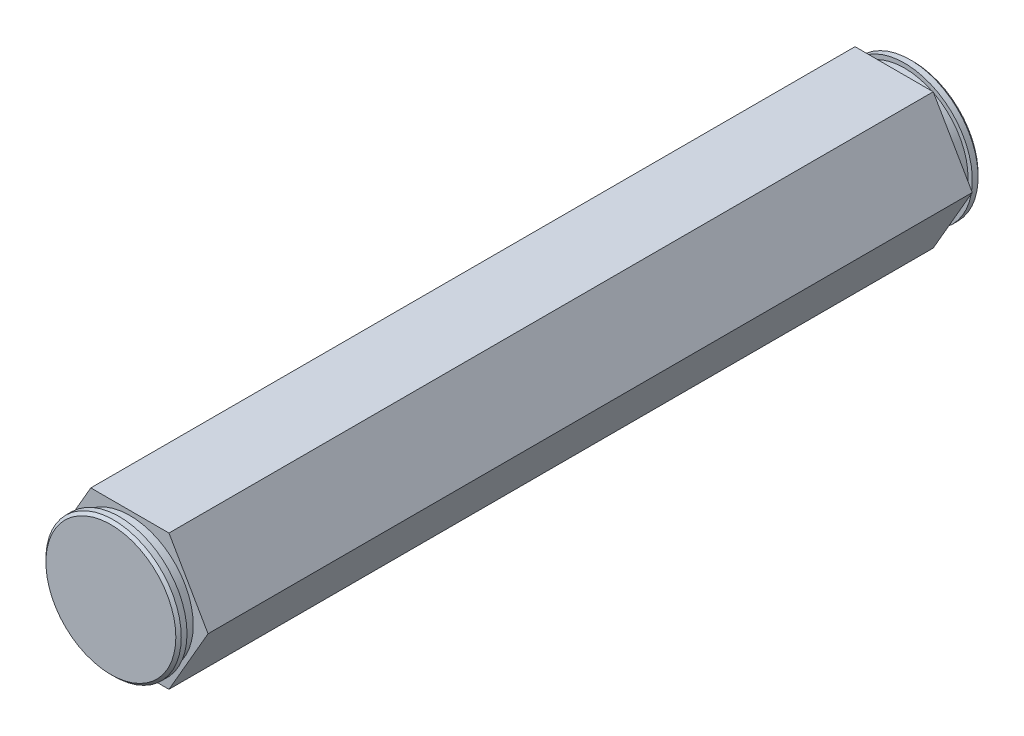
ISO-10303-21;
HEADER;
FILE_DESCRIPTION(('STEP AP214'),'2;1');
FILE_NAME('part.step','',(''),(''),'','','');
FILE_SCHEMA(('AUTOMOTIVE_DESIGN { 1 0 10303 214 1 1 1 1 }'));
ENDSEC;
DATA;
#1=APPLICATION_CONTEXT('core data for automotive mechanical design processes');
#2=APPLICATION_PROTOCOL_DEFINITION('international standard','automotive_design',2000,#1);
#3=PRODUCT_CONTEXT('',#1,'mechanical');
#4=PRODUCT('Part','Part','',(#3));
#5=PRODUCT_RELATED_PRODUCT_CATEGORY('part','',(#4));
#6=PRODUCT_DEFINITION_FORMATION('','',#4);
#7=PRODUCT_DEFINITION_CONTEXT('part definition',#1,'design');
#8=PRODUCT_DEFINITION('design','',#6,#7);
#9=PRODUCT_DEFINITION_SHAPE('','',#8);
#10=(LENGTH_UNIT() NAMED_UNIT(*) SI_UNIT(.MILLI.,.METRE.));
#11=(NAMED_UNIT(*) PLANE_ANGLE_UNIT() SI_UNIT($,.RADIAN.));
#12=(NAMED_UNIT(*) SI_UNIT($,.STERADIAN.) SOLID_ANGLE_UNIT());
#13=UNCERTAINTY_MEASURE_WITH_UNIT(LENGTH_MEASURE(1.E-05),#10,'distance_accuracy_value','');
#14=(GEOMETRIC_REPRESENTATION_CONTEXT(3) GLOBAL_UNCERTAINTY_ASSIGNED_CONTEXT((#13)) GLOBAL_UNIT_ASSIGNED_CONTEXT((#10,
#11,#12)) REPRESENTATION_CONTEXT('',''));
#15=CARTESIAN_POINT('',(0.,0.,0.));
#16=DIRECTION('',(0.,0.,1.));
#17=DIRECTION('',(1.,0.,0.));
#18=AXIS2_PLACEMENT_3D('',#15,#16,#17);
#19=CARTESIAN_POINT('',(0.,0.,57.404));
#20=DIRECTION('',(0.,0.,1.));
#21=DIRECTION('',(1.,0.,0.));
#22=AXIS2_PLACEMENT_3D('',#19,#20,#21);
#23=PLANE('',#22);
#24=DIRECTION('',(-0.500000000000007,0.866025403784435,0.));
#25=VECTOR('',#24,1.);
#26=CARTESIAN_POINT('',(7.33234841870824,1.02782365951626E-13,57.404));
#27=LINE('',#26,#25);
#28=CARTESIAN_POINT('',(7.33234841870824,1.02782365951626E-13,57.404));
#29=VERTEX_POINT('',#28);
#30=CARTESIAN_POINT('',(3.6661742093541,6.35,57.404));
#31=VERTEX_POINT('',#30);
#32=EDGE_CURVE('E92',#29,#31,#27,.T.);
#33=ORIENTED_EDGE('',*,*,#32,.T.);
#34=DIRECTION('',(-1.,0.,0.));
#35=VECTOR('',#34,1.);
#36=CARTESIAN_POINT('',(3.6661742093541,6.35,57.404));
#37=LINE('',#36,#35);
#38=CARTESIAN_POINT('',(-3.66617420935415,6.34999999999998,57.404));
#39=VERTEX_POINT('',#38);
#40=EDGE_CURVE('E100',#31,#39,#37,.T.);
#41=ORIENTED_EDGE('',*,*,#40,.T.);
#42=DIRECTION('',(-0.499999999999995,-0.866025403784442,0.));
#43=VECTOR('',#42,1.);
#44=CARTESIAN_POINT('',(-3.66617420935415,6.34999999999998,57.404));
#45=LINE('',#44,#43);
#46=CARTESIAN_POINT('',(-7.33234841870824,0.,57.404));
#47=VERTEX_POINT('',#46);
#48=EDGE_CURVE('E106',#39,#47,#45,.T.);
#49=ORIENTED_EDGE('',*,*,#48,.T.);
#50=DIRECTION('',(0.500000000000007,-0.866025403784435,0.));
#51=VECTOR('',#50,1.);
#52=CARTESIAN_POINT('',(-7.33234841870824,0.,57.404));
#53=LINE('',#52,#51);
#54=CARTESIAN_POINT('',(-3.66617420935406,-6.35000000000003,57.404));
#55=VERTEX_POINT('',#54);
#56=EDGE_CURVE('E121',#47,#55,#53,.T.);
#57=ORIENTED_EDGE('',*,*,#56,.T.);
#58=DIRECTION('',(1.,0.,0.));
#59=VECTOR('',#58,1.);
#60=CARTESIAN_POINT('',(-3.66617420935406,-6.35000000000003,57.404));
#61=LINE('',#60,#59);
#62=CARTESIAN_POINT('',(3.66617420935419,-6.34999999999995,57.404));
#63=VERTEX_POINT('',#62);
#64=EDGE_CURVE('E124',#55,#63,#61,.T.);
#65=ORIENTED_EDGE('',*,*,#64,.T.);
#66=DIRECTION('',(0.499999999999989,0.866025403784445,0.));
#67=VECTOR('',#66,1.);
#68=CARTESIAN_POINT('',(3.66617420935419,-6.34999999999995,57.404));
#69=LINE('',#68,#67);
#70=EDGE_CURVE('E112',#63,#29,#69,.T.);
#71=ORIENTED_EDGE('',*,*,#70,.T.);
#72=EDGE_LOOP('',(#33,#41,#49,#57,#65,#71));
#73=FACE_BOUND('',#72,.T.);
#74=CARTESIAN_POINT('',(0.,0.,57.404));
#75=DIRECTION('',(0.,0.,1.));
#76=DIRECTION('',(1.,0.,0.));
#77=AXIS2_PLACEMENT_3D('',#74,#75,#76);
#78=CIRCLE('',#77,5.9436);
#79=CARTESIAN_POINT('',(5.9436,0.,57.404));
#80=VERTEX_POINT('',#79);
#81=EDGE_CURVE('E116',#80,#80,#78,.T.);
#82=ORIENTED_EDGE('',*,*,#81,.F.);
#83=EDGE_LOOP('',(#82));
#84=FACE_BOUND('',#83,.T.);
#85=ADVANCED_FACE('F33',(#73,#84),#23,.T.);
#86=CARTESIAN_POINT('',(0.,0.,-14.2875));
#87=DIRECTION('',(0.,0.,1.));
#88=DIRECTION('',(1.,0.,0.));
#89=AXIS2_PLACEMENT_3D('',#86,#87,#88);
#90=PLANE('',#89);
#91=DIRECTION('',(0.499999999999995,0.866025403784442,0.));
#92=VECTOR('',#91,1.);
#93=CARTESIAN_POINT('',(3.66617420935419,-6.34999999999995,-14.2875));
#94=LINE('',#93,#92);
#95=CARTESIAN_POINT('',(3.66617420935419,-6.34999999999995,-14.2875));
#96=VERTEX_POINT('',#95);
#97=CARTESIAN_POINT('',(7.33234841870824,0.,-14.2875));
#98=VERTEX_POINT('',#97);
#99=EDGE_CURVE('E139',#96,#98,#94,.T.);
#100=ORIENTED_EDGE('',*,*,#99,.F.);
#101=DIRECTION('',(1.,0.,0.));
#102=VECTOR('',#101,1.);
#103=CARTESIAN_POINT('',(-3.66617420935406,-6.35000000000002,-14.2875));
#104=LINE('',#103,#102);
#105=CARTESIAN_POINT('',(-3.66617420935406,-6.35000000000002,-14.2875));
#106=VERTEX_POINT('',#105);
#107=EDGE_CURVE('E48',#106,#96,#104,.T.);
#108=ORIENTED_EDGE('',*,*,#107,.F.);
#109=DIRECTION('',(0.500000000000007,-0.866025403784435,0.));
#110=VECTOR('',#109,1.);
#111=CARTESIAN_POINT('',(-7.33234841870824,0.,-14.2875));
#112=LINE('',#111,#110);
#113=CARTESIAN_POINT('',(-7.33234841870824,0.,-14.2875));
#114=VERTEX_POINT('',#113);
#115=EDGE_CURVE('E56',#114,#106,#112,.T.);
#116=ORIENTED_EDGE('',*,*,#115,.F.);
#117=DIRECTION('',(-0.499999999999995,-0.866025403784442,0.));
#118=VECTOR('',#117,1.);
#119=CARTESIAN_POINT('',(-3.66617420935415,6.34999999999997,-14.2875));
#120=LINE('',#119,#118);
#121=CARTESIAN_POINT('',(-3.66617420935415,6.34999999999997,-14.2875));
#122=VERTEX_POINT('',#121);
#123=EDGE_CURVE('E145',#122,#114,#120,.T.);
#124=ORIENTED_EDGE('',*,*,#123,.F.);
#125=DIRECTION('',(-1.,0.,0.));
#126=VECTOR('',#125,1.);
#127=CARTESIAN_POINT('',(3.6661742093541,6.35,-14.2875));
#128=LINE('',#127,#126);
#129=CARTESIAN_POINT('',(3.6661742093541,6.35,-14.2875));
#130=VERTEX_POINT('',#129);
#131=EDGE_CURVE('E143',#130,#122,#128,.T.);
#132=ORIENTED_EDGE('',*,*,#131,.F.);
#133=DIRECTION('',(-0.500000000000001,0.866025403784438,0.));
#134=VECTOR('',#133,1.);
#135=CARTESIAN_POINT('',(7.33234841870824,0.,-14.2875));
#136=LINE('',#135,#134);
#137=EDGE_CURVE('E93',#98,#130,#136,.T.);
#138=ORIENTED_EDGE('',*,*,#137,.F.);
#139=EDGE_LOOP('',(#100,#108,#116,#124,#132,#138));
#140=FACE_BOUND('',#139,.T.);
#141=CARTESIAN_POINT('',(0.,0.,-14.2875));
#142=DIRECTION('',(0.,0.,1.));
#143=DIRECTION('',(1.,0.,0.));
#144=AXIS2_PLACEMENT_3D('',#141,#142,#143);
#145=CIRCLE('',#144,5.9436);
#146=CARTESIAN_POINT('',(5.9436,0.,-14.2875));
#147=VERTEX_POINT('',#146);
#148=EDGE_CURVE('E157',#147,#147,#145,.F.);
#149=ORIENTED_EDGE('',*,*,#148,.F.);
#150=EDGE_LOOP('',(#149));
#151=FACE_BOUND('',#150,.T.);
#152=ADVANCED_FACE('F179',(#140,#151),#90,.F.);
#153=CARTESIAN_POINT('',(3.66617420935419,-6.34999999999995,14.2875));
#154=DIRECTION('',(-0.866025403784442,0.499999999999995,0.));
#155=DIRECTION('',(-0.499999999999995,-0.866025403784441,0.));
#156=AXIS2_PLACEMENT_3D('',#153,#154,#155);
#157=PLANE('',#156);
#158=ORIENTED_EDGE('',*,*,#99,.T.);
#159=DIRECTION('',(0.,0.,-1.));
#160=VECTOR('',#159,1.);
#161=CARTESIAN_POINT('',(7.33234841870824,0.,14.2875));
#162=LINE('',#161,#160);
#163=EDGE_CURVE('E96',#29,#98,#162,.T.);
#164=ORIENTED_EDGE('',*,*,#163,.F.);
#165=ORIENTED_EDGE('',*,*,#70,.F.);
#166=DIRECTION('',(0.,0.,-1.));
#167=VECTOR('',#166,1.);
#168=CARTESIAN_POINT('',(3.66617420935419,-6.34999999999995,14.2875));
#169=LINE('',#168,#167);
#170=EDGE_CURVE('E149',#63,#96,#169,.T.);
#171=ORIENTED_EDGE('',*,*,#170,.T.);
#172=EDGE_LOOP('',(#158,#164,#165,#171));
#173=FACE_BOUND('',#172,.T.);
#174=ADVANCED_FACE('F186',(#173),#157,.F.);
#175=CARTESIAN_POINT('',(7.33234841870824,0.,14.2875));
#176=DIRECTION('',(-0.866025403784438,-0.500000000000001,0.));
#177=DIRECTION('',(0.500000000000001,-0.866025403784438,0.));
#178=AXIS2_PLACEMENT_3D('',#175,#176,#177);
#179=PLANE('',#178);
#180=ORIENTED_EDGE('',*,*,#137,.T.);
#181=DIRECTION('',(0.,0.,-1.));
#182=VECTOR('',#181,1.);
#183=CARTESIAN_POINT('',(3.6661742093541,6.35,14.2875));
#184=LINE('',#183,#182);
#185=EDGE_CURVE('E87',#31,#130,#184,.T.);
#186=ORIENTED_EDGE('',*,*,#185,.F.);
#187=ORIENTED_EDGE('',*,*,#32,.F.);
#188=ORIENTED_EDGE('',*,*,#163,.T.);
#189=EDGE_LOOP('',(#180,#186,#187,#188));
#190=FACE_BOUND('',#189,.T.);
#191=ADVANCED_FACE('F89',(#190),#179,.F.);
#192=CARTESIAN_POINT('',(3.6661742093541,6.35,14.2875));
#193=DIRECTION('',(0.,-1.,0.));
#194=DIRECTION('',(1.,0.,0.));
#195=AXIS2_PLACEMENT_3D('',#192,#193,#194);
#196=PLANE('',#195);
#197=ORIENTED_EDGE('',*,*,#131,.T.);
#198=DIRECTION('',(0.,0.,-1.));
#199=VECTOR('',#198,1.);
#200=CARTESIAN_POINT('',(-3.66617420935415,6.34999999999997,14.2875));
#201=LINE('',#200,#199);
#202=EDGE_CURVE('E97',#39,#122,#201,.T.);
#203=ORIENTED_EDGE('',*,*,#202,.F.);
#204=ORIENTED_EDGE('',*,*,#40,.F.);
#205=ORIENTED_EDGE('',*,*,#185,.T.);
#206=EDGE_LOOP('',(#197,#203,#204,#205));
#207=FACE_BOUND('',#206,.T.);
#208=ADVANCED_FACE('F101',(#207),#196,.F.);
#209=CARTESIAN_POINT('',(-3.66617420935415,6.34999999999997,14.2875));
#210=DIRECTION('',(0.866025403784441,-0.499999999999995,0.));
#211=DIRECTION('',(0.499999999999995,0.866025403784442,0.));
#212=AXIS2_PLACEMENT_3D('',#209,#210,#211);
#213=PLANE('',#212);
#214=ORIENTED_EDGE('',*,*,#123,.T.);
#215=DIRECTION('',(0.,0.,-1.));
#216=VECTOR('',#215,1.);
#217=CARTESIAN_POINT('',(-7.33234841870824,0.,14.2875));
#218=LINE('',#217,#216);
#219=EDGE_CURVE('E153',#47,#114,#218,.T.);
#220=ORIENTED_EDGE('',*,*,#219,.F.);
#221=ORIENTED_EDGE('',*,*,#48,.F.);
#222=ORIENTED_EDGE('',*,*,#202,.T.);
#223=EDGE_LOOP('',(#214,#220,#221,#222));
#224=FACE_BOUND('',#223,.T.);
#225=ADVANCED_FACE('F224',(#224),#213,.F.);
#226=CARTESIAN_POINT('',(-7.33234841870824,0.,14.2875));
#227=DIRECTION('',(0.866025403784435,0.500000000000007,0.));
#228=DIRECTION('',(-0.500000000000007,0.866025403784435,0.));
#229=AXIS2_PLACEMENT_3D('',#226,#227,#228);
#230=PLANE('',#229);
#231=ORIENTED_EDGE('',*,*,#115,.T.);
#232=DIRECTION('',(0.,0.,-1.));
#233=VECTOR('',#232,1.);
#234=CARTESIAN_POINT('',(-3.66617420935406,-6.35000000000002,14.2875));
#235=LINE('',#234,#233);
#236=EDGE_CURVE('E151',#55,#106,#235,.T.);
#237=ORIENTED_EDGE('',*,*,#236,.F.);
#238=ORIENTED_EDGE('',*,*,#56,.F.);
#239=ORIENTED_EDGE('',*,*,#219,.T.);
#240=EDGE_LOOP('',(#231,#237,#238,#239));
#241=FACE_BOUND('',#240,.T.);
#242=ADVANCED_FACE('F221',(#241),#230,.F.);
#243=CARTESIAN_POINT('',(-3.66617420935406,-6.35000000000002,14.2875));
#244=DIRECTION('',(0.,1.,0.));
#245=DIRECTION('',(-1.,0.,0.));
#246=AXIS2_PLACEMENT_3D('',#243,#244,#245);
#247=PLANE('',#246);
#248=ORIENTED_EDGE('',*,*,#107,.T.);
#249=ORIENTED_EDGE('',*,*,#170,.F.);
#250=ORIENTED_EDGE('',*,*,#64,.F.);
#251=ORIENTED_EDGE('',*,*,#236,.T.);
#252=EDGE_LOOP('',(#248,#249,#250,#251));
#253=FACE_BOUND('',#252,.T.);
#254=ADVANCED_FACE('F216',(#253),#247,.F.);
#255=CARTESIAN_POINT('',(0.,0.,-15.2781));
#256=DIRECTION('',(0.,0.,1.));
#257=DIRECTION('',(1.,0.,0.));
#258=AXIS2_PLACEMENT_3D('',#255,#256,#257);
#259=CYLINDRICAL_SURFACE('',#258,5.9436);
#260=CARTESIAN_POINT('',(0.,0.,-15.2781));
#261=DIRECTION('',(0.,0.,-1.));
#262=DIRECTION('',(-1.,0.,0.));
#263=AXIS2_PLACEMENT_3D('',#260,#261,#262);
#264=CIRCLE('',#263,5.9436);
#265=CARTESIAN_POINT('',(-5.9436,0.,-15.2781));
#266=VERTEX_POINT('',#265);
#267=EDGE_CURVE('E136',#266,#266,#264,.T.);
#268=ORIENTED_EDGE('',*,*,#267,.F.);
#269=EDGE_LOOP('',(#268));
#270=FACE_BOUND('',#269,.T.);
#271=ORIENTED_EDGE('',*,*,#148,.T.);
#272=EDGE_LOOP('',(#271));
#273=FACE_BOUND('',#272,.T.);
#274=ADVANCED_FACE('F210',(#270,#273),#259,.T.);
#275=CARTESIAN_POINT('',(0.,0.,-15.2781));
#276=DIRECTION('',(0.,0.,-1.));
#277=DIRECTION('',(-1.,0.,0.));
#278=AXIS2_PLACEMENT_3D('',#275,#276,#277);
#279=PLANE('',#278);
#280=CARTESIAN_POINT('',(0.,0.,-15.2781));
#281=DIRECTION('',(0.,0.,-1.));
#282=DIRECTION('',(-1.,0.,0.));
#283=AXIS2_PLACEMENT_3D('',#280,#281,#282);
#284=CIRCLE('',#283,6.35);
#285=CARTESIAN_POINT('',(-6.35,0.,-15.2781));
#286=VERTEX_POINT('',#285);
#287=EDGE_CURVE('E131',#286,#286,#284,.T.);
#288=ORIENTED_EDGE('',*,*,#287,.F.);
#289=EDGE_LOOP('',(#288));
#290=FACE_BOUND('',#289,.T.);
#291=ORIENTED_EDGE('',*,*,#267,.T.);
#292=EDGE_LOOP('',(#291));
#293=FACE_BOUND('',#292,.T.);
#294=ADVANCED_FACE('F207',(#290,#293),#279,.F.);
#295=CARTESIAN_POINT('',(0.,0.,-16.07185));
#296=DIRECTION('',(0.,0.,1.));
#297=DIRECTION('',(1.,0.,0.));
#298=AXIS2_PLACEMENT_3D('',#295,#296,#297);
#299=CYLINDRICAL_SURFACE('',#298,6.35);
#300=CARTESIAN_POINT('',(0.,0.,-15.81785));
#301=DIRECTION('',(0.,0.,-1.));
#302=DIRECTION('',(-1.,0.,0.));
#303=AXIS2_PLACEMENT_3D('',#300,#301,#302);
#304=CIRCLE('',#303,6.35);
#305=CARTESIAN_POINT('',(-6.35,0.,-15.81785));
#306=VERTEX_POINT('',#305);
#307=EDGE_CURVE('E163',#306,#306,#304,.F.);
#308=ORIENTED_EDGE('',*,*,#307,.T.);
#309=EDGE_LOOP('',(#308));
#310=FACE_BOUND('',#309,.T.);
#311=ORIENTED_EDGE('',*,*,#287,.T.);
#312=EDGE_LOOP('',(#311));
#313=FACE_BOUND('',#312,.T.);
#314=ADVANCED_FACE('F205',(#310,#313),#299,.T.);
#315=CARTESIAN_POINT('',(0.,0.,-16.07185));
#316=DIRECTION('',(0.,0.,-1.));
#317=DIRECTION('',(-1.,0.,0.));
#318=AXIS2_PLACEMENT_3D('',#315,#316,#317);
#319=PLANE('',#318);
#320=CARTESIAN_POINT('',(0.,0.,-16.07185));
#321=DIRECTION('',(0.,0.,-1.));
#322=DIRECTION('',(-1.,0.,0.));
#323=AXIS2_PLACEMENT_3D('',#320,#321,#322);
#324=CIRCLE('',#323,3.175);
#325=CARTESIAN_POINT('',(-3.175,0.,-16.07185));
#326=VERTEX_POINT('',#325);
#327=EDGE_CURVE('E127',#326,#326,#324,.T.);
#328=ORIENTED_EDGE('',*,*,#327,.F.);
#329=EDGE_LOOP('',(#328));
#330=FACE_BOUND('',#329,.T.);
#331=CARTESIAN_POINT('',(0.,0.,-16.07185));
#332=DIRECTION('',(0.,0.,-1.));
#333=DIRECTION('',(-1.,0.,0.));
#334=AXIS2_PLACEMENT_3D('',#331,#332,#333);
#335=CIRCLE('',#334,6.096);
#336=CARTESIAN_POINT('',(-6.096,0.,-16.07185));
#337=VERTEX_POINT('',#336);
#338=EDGE_CURVE('E160',#337,#337,#335,.T.);
#339=ORIENTED_EDGE('',*,*,#338,.T.);
#340=EDGE_LOOP('',(#339));
#341=FACE_BOUND('',#340,.T.);
#342=ADVANCED_FACE('F202',(#330,#341),#319,.T.);
#343=CARTESIAN_POINT('',(0.,0.,-16.07185));
#344=DIRECTION('',(0.,0.,1.));
#345=DIRECTION('',(1.,0.,0.));
#346=AXIS2_PLACEMENT_3D('',#343,#344,#345);
#347=CONICAL_SURFACE('',#346,6.096,0.785398163397431);
#348=ORIENTED_EDGE('',*,*,#307,.F.);
#349=EDGE_LOOP('',(#348));
#350=FACE_BOUND('',#349,.T.);
#351=ORIENTED_EDGE('',*,*,#338,.F.);
#352=EDGE_LOOP('',(#351));
#353=FACE_BOUND('',#352,.T.);
#354=ADVANCED_FACE('F200',(#350,#353),#347,.T.);
#355=CARTESIAN_POINT('',(0.,0.,-3.37185));
#356=DIRECTION('',(0.,0.,-1.));
#357=DIRECTION('',(-1.,0.,0.));
#358=AXIS2_PLACEMENT_3D('',#355,#356,#357);
#359=CYLINDRICAL_SURFACE('',#358,3.175);
#360=CARTESIAN_POINT('',(0.,0.,-3.37185));
#361=DIRECTION('',(0.,0.,-1.));
#362=DIRECTION('',(-1.,0.,0.));
#363=AXIS2_PLACEMENT_3D('',#360,#361,#362);
#364=CIRCLE('',#363,3.175);
#365=CARTESIAN_POINT('',(-3.175,0.,-3.37185));
#366=VERTEX_POINT('',#365);
#367=EDGE_CURVE('E128',#366,#366,#364,.T.);
#368=ORIENTED_EDGE('',*,*,#367,.F.);
#369=EDGE_LOOP('',(#368));
#370=FACE_BOUND('',#369,.T.);
#371=ORIENTED_EDGE('',*,*,#327,.T.);
#372=EDGE_LOOP('',(#371));
#373=FACE_BOUND('',#372,.T.);
#374=ADVANCED_FACE('F196',(#370,#373),#359,.F.);
#375=CARTESIAN_POINT('',(0.,0.,-3.37185));
#376=DIRECTION('',(0.,0.,-1.));
#377=DIRECTION('',(-1.,0.,0.));
#378=AXIS2_PLACEMENT_3D('',#375,#376,#377);
#379=PLANE('',#378);
#380=ORIENTED_EDGE('',*,*,#367,.T.);
#381=EDGE_LOOP('',(#380));
#382=FACE_BOUND('',#381,.T.);
#383=ADVANCED_FACE('F193',(#382),#379,.T.);
#384=CARTESIAN_POINT('',(0.,0.,58.3946));
#385=DIRECTION('',(0.,0.,-1.));
#386=DIRECTION('',(-1.,0.,0.));
#387=AXIS2_PLACEMENT_3D('',#384,#385,#386);
#388=CYLINDRICAL_SURFACE('',#387,5.9436);
#389=CARTESIAN_POINT('',(0.,0.,58.3946));
#390=DIRECTION('',(0.,0.,1.));
#391=DIRECTION('',(1.,0.,0.));
#392=AXIS2_PLACEMENT_3D('',#389,#390,#391);
#393=CIRCLE('',#392,5.9436);
#394=CARTESIAN_POINT('',(5.9436,0.,58.3946));
#395=VERTEX_POINT('',#394);
#396=EDGE_CURVE('E113',#395,#395,#393,.T.);
#397=ORIENTED_EDGE('',*,*,#396,.F.);
#398=EDGE_LOOP('',(#397));
#399=FACE_BOUND('',#398,.T.);
#400=ORIENTED_EDGE('',*,*,#81,.T.);
#401=EDGE_LOOP('',(#400));
#402=FACE_BOUND('',#401,.T.);
#403=ADVANCED_FACE('F191',(#399,#402),#388,.T.);
#404=CARTESIAN_POINT('',(0.,0.,58.3946));
#405=DIRECTION('',(0.,0.,1.));
#406=DIRECTION('',(1.,0.,0.));
#407=AXIS2_PLACEMENT_3D('',#404,#405,#406);
#408=PLANE('',#407);
#409=CARTESIAN_POINT('',(0.,0.,58.3946));
#410=DIRECTION('',(0.,0.,1.));
#411=DIRECTION('',(1.,0.,0.));
#412=AXIS2_PLACEMENT_3D('',#409,#410,#411);
#413=CIRCLE('',#412,6.35);
#414=CARTESIAN_POINT('',(6.35,0.,58.3946));
#415=VERTEX_POINT('',#414);
#416=EDGE_CURVE('E306',#415,#415,#413,.T.);
#417=ORIENTED_EDGE('',*,*,#416,.F.);
#418=EDGE_LOOP('',(#417));
#419=FACE_BOUND('',#418,.T.);
#420=ORIENTED_EDGE('',*,*,#396,.T.);
#421=EDGE_LOOP('',(#420));
#422=FACE_BOUND('',#421,.T.);
#423=ADVANCED_FACE('F272',(#419,#422),#408,.F.);
#424=CARTESIAN_POINT('',(0.,0.,59.18835));
#425=DIRECTION('',(0.,0.,-1.));
#426=DIRECTION('',(-1.,0.,0.));
#427=AXIS2_PLACEMENT_3D('',#424,#425,#426);
#428=CYLINDRICAL_SURFACE('',#427,6.35);
#429=CARTESIAN_POINT('',(0.,0.,58.93435));
#430=DIRECTION('',(0.,0.,1.));
#431=DIRECTION('',(1.,0.,0.));
#432=AXIS2_PLACEMENT_3D('',#429,#430,#431);
#433=CIRCLE('',#432,6.35);
#434=CARTESIAN_POINT('',(6.35,0.,58.93435));
#435=VERTEX_POINT('',#434);
#436=EDGE_CURVE('E11',#435,#435,#433,.F.);
#437=ORIENTED_EDGE('',*,*,#436,.T.);
#438=EDGE_LOOP('',(#437));
#439=FACE_BOUND('',#438,.T.);
#440=ORIENTED_EDGE('',*,*,#416,.T.);
#441=EDGE_LOOP('',(#440));
#442=FACE_BOUND('',#441,.T.);
#443=ADVANCED_FACE('F175',(#439,#442),#428,.T.);
#444=CARTESIAN_POINT('',(0.,0.,59.18835));
#445=DIRECTION('',(0.,0.,1.));
#446=DIRECTION('',(1.,0.,0.));
#447=AXIS2_PLACEMENT_3D('',#444,#445,#446);
#448=PLANE('',#447);
#449=CARTESIAN_POINT('',(0.,0.,59.18835));
#450=DIRECTION('',(0.,0.,1.));
#451=DIRECTION('',(1.,0.,0.));
#452=AXIS2_PLACEMENT_3D('',#449,#450,#451);
#453=CIRCLE('',#452,6.09600000000001);
#454=CARTESIAN_POINT('',(6.09600000000001,0.,59.18835));
#455=VERTEX_POINT('',#454);
#456=EDGE_CURVE('E41',#455,#455,#453,.T.);
#457=ORIENTED_EDGE('',*,*,#456,.T.);
#458=EDGE_LOOP('',(#457));
#459=FACE_BOUND('',#458,.T.);
#460=ADVANCED_FACE('F168',(#459),#448,.T.);
#461=CARTESIAN_POINT('',(0.,0.,59.18835));
#462=DIRECTION('',(0.,0.,-1.));
#463=DIRECTION('',(-1.,0.,0.));
#464=AXIS2_PLACEMENT_3D('',#461,#462,#463);
#465=CONICAL_SURFACE('',#464,6.09600000000001,0.785398163397472);
#466=ORIENTED_EDGE('',*,*,#436,.F.);
#467=EDGE_LOOP('',(#466));
#468=FACE_BOUND('',#467,.T.);
#469=ORIENTED_EDGE('',*,*,#456,.F.);
#470=EDGE_LOOP('',(#469));
#471=FACE_BOUND('',#470,.T.);
#472=ADVANCED_FACE('F35',(#468,#471),#465,.T.);
#473=CLOSED_SHELL('',(#85,#152,#174,#191,#208,#225,#242,#254,#274,#294,#314,#342,#354,#374,#383,
#403,#423,#443,#460,#472));
#474=MANIFOLD_SOLID_BREP('B2',#473);
#475=ADVANCED_BREP_SHAPE_REPRESENTATION('',(#18,#474),#14);
#476=SHAPE_DEFINITION_REPRESENTATION(#9,#475);
ENDSEC;
END-ISO-10303-21;
